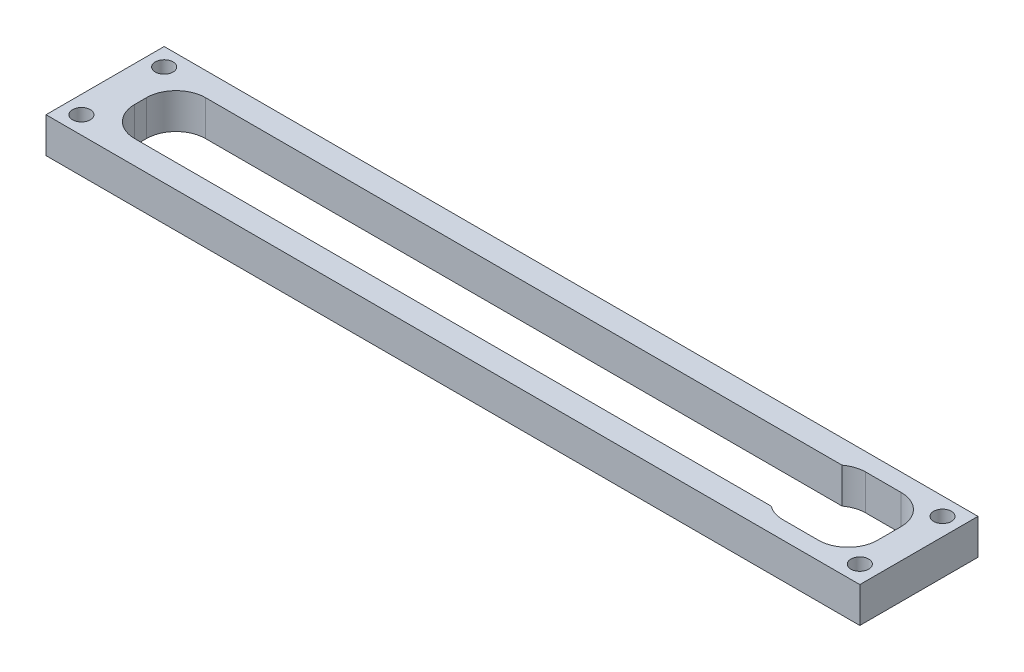
ISO-10303-21;
HEADER;
FILE_DESCRIPTION(('STEP AP214'),'2;1');
FILE_NAME('part.step','',(''),(''),'','','');
FILE_SCHEMA(('AUTOMOTIVE_DESIGN { 1 0 10303 214 1 1 1 1 }'));
ENDSEC;
DATA;
#1=APPLICATION_CONTEXT('core data for automotive mechanical design processes');
#2=APPLICATION_PROTOCOL_DEFINITION('international standard','automotive_design',2000,#1);
#3=PRODUCT_CONTEXT('',#1,'mechanical');
#4=PRODUCT('Part','Part','',(#3));
#5=PRODUCT_RELATED_PRODUCT_CATEGORY('part','',(#4));
#6=PRODUCT_DEFINITION_FORMATION('','',#4);
#7=PRODUCT_DEFINITION_CONTEXT('part definition',#1,'design');
#8=PRODUCT_DEFINITION('design','',#6,#7);
#9=PRODUCT_DEFINITION_SHAPE('','',#8);
#10=(LENGTH_UNIT() NAMED_UNIT(*) SI_UNIT(.MILLI.,.METRE.));
#11=(NAMED_UNIT(*) PLANE_ANGLE_UNIT() SI_UNIT($,.RADIAN.));
#12=(NAMED_UNIT(*) SI_UNIT($,.STERADIAN.) SOLID_ANGLE_UNIT());
#13=UNCERTAINTY_MEASURE_WITH_UNIT(LENGTH_MEASURE(1.E-05),#10,'distance_accuracy_value','');
#14=(GEOMETRIC_REPRESENTATION_CONTEXT(3) GLOBAL_UNCERTAINTY_ASSIGNED_CONTEXT((#13)) GLOBAL_UNIT_ASSIGNED_CONTEXT((#10,
#11,#12)) REPRESENTATION_CONTEXT('',''));
#15=CARTESIAN_POINT('',(0.,0.,0.));
#16=DIRECTION('',(0.,0.,1.));
#17=DIRECTION('',(1.,0.,0.));
#18=AXIS2_PLACEMENT_3D('',#15,#16,#17);
#19=CARTESIAN_POINT('',(0.,6.,0.));
#20=DIRECTION('',(0.,-1.,0.));
#21=DIRECTION('',(0.,0.,-1.));
#22=AXIS2_PLACEMENT_3D('',#19,#20,#21);
#23=PLANE('',#22);
#24=DIRECTION('',(0.,0.,1.));
#25=VECTOR('',#24,1.);
#26=CARTESIAN_POINT('',(0.,6.,0.));
#27=LINE('',#26,#25);
#28=CARTESIAN_POINT('',(0.,6.,-20.));
#29=VERTEX_POINT('',#28);
#30=CARTESIAN_POINT('',(0.,6.,0.));
#31=VERTEX_POINT('',#30);
#32=EDGE_CURVE('E250',#29,#31,#27,.T.);
#33=ORIENTED_EDGE('',*,*,#32,.T.);
#34=DIRECTION('',(1.,0.,0.));
#35=VECTOR('',#34,1.);
#36=CARTESIAN_POINT('',(0.,6.,0.));
#37=LINE('',#36,#35);
#38=CARTESIAN_POINT('',(137.727780531203,6.,0.));
#39=VERTEX_POINT('',#38);
#40=EDGE_CURVE('E253',#31,#39,#37,.T.);
#41=ORIENTED_EDGE('',*,*,#40,.T.);
#42=DIRECTION('',(0.,0.,-1.));
#43=VECTOR('',#42,1.);
#44=CARTESIAN_POINT('',(137.727780531203,6.,0.));
#45=LINE('',#44,#43);
#46=CARTESIAN_POINT('',(137.727780531203,6.,-20.));
#47=VERTEX_POINT('',#46);
#48=EDGE_CURVE('E256',#39,#47,#45,.T.);
#49=ORIENTED_EDGE('',*,*,#48,.T.);
#50=DIRECTION('',(-1.,0.,0.));
#51=VECTOR('',#50,1.);
#52=CARTESIAN_POINT('',(0.,6.,-20.));
#53=LINE('',#52,#51);
#54=EDGE_CURVE('E258',#47,#29,#53,.T.);
#55=ORIENTED_EDGE('',*,*,#54,.T.);
#56=EDGE_LOOP('',(#33,#41,#49,#55));
#57=FACE_BOUND('',#56,.T.);
#58=DIRECTION('',(-1.,0.,0.));
#59=VECTOR('',#58,1.);
#60=CARTESIAN_POINT('',(5.99999999999999,6.,-16.));
#61=LINE('',#60,#59);
#62=CARTESIAN_POINT('',(118.727780531203,6.,-16.));
#63=VERTEX_POINT('',#62);
#64=CARTESIAN_POINT('',(11.,6.,-16.));
#65=VERTEX_POINT('',#64);
#66=EDGE_CURVE('E243',#63,#65,#61,.T.);
#67=ORIENTED_EDGE('',*,*,#66,.F.);
#68=CARTESIAN_POINT('',(121.727780531203,6.,-12.));
#69=DIRECTION('',(0.,-1.,0.));
#70=DIRECTION('',(0.,0.,-1.));
#71=AXIS2_PLACEMENT_3D('',#68,#69,#70);
#72=CIRCLE('',#71,5.);
#73=CARTESIAN_POINT('',(121.727780531203,6.,-17.));
#74=VERTEX_POINT('',#73);
#75=EDGE_CURVE('E193',#63,#74,#72,.T.);
#76=ORIENTED_EDGE('',*,*,#75,.T.);
#77=DIRECTION('',(-1.,0.,0.));
#78=VECTOR('',#77,1.);
#79=CARTESIAN_POINT('',(118.727780531203,6.,-17.));
#80=LINE('',#79,#78);
#81=CARTESIAN_POINT('',(127.727780531203,6.,-17.));
#82=VERTEX_POINT('',#81);
#83=EDGE_CURVE('E205',#82,#74,#80,.T.);
#84=ORIENTED_EDGE('',*,*,#83,.F.);
#85=CARTESIAN_POINT('',(127.727780531203,6.,-12.));
#86=DIRECTION('',(0.,-1.,0.));
#87=DIRECTION('',(0.,0.,-1.));
#88=AXIS2_PLACEMENT_3D('',#85,#86,#87);
#89=CIRCLE('',#88,5.);
#90=CARTESIAN_POINT('',(132.727780531203,6.,-12.));
#91=VERTEX_POINT('',#90);
#92=EDGE_CURVE('E185',#82,#91,#89,.T.);
#93=ORIENTED_EDGE('',*,*,#92,.T.);
#94=DIRECTION('',(0.,0.,-1.));
#95=VECTOR('',#94,1.);
#96=CARTESIAN_POINT('',(132.727780531203,6.,-17.));
#97=LINE('',#96,#95);
#98=CARTESIAN_POINT('',(132.727780531203,6.,-8.00000000000002));
#99=VERTEX_POINT('',#98);
#100=EDGE_CURVE('E202',#99,#91,#97,.T.);
#101=ORIENTED_EDGE('',*,*,#100,.F.);
#102=CARTESIAN_POINT('',(127.727780531203,6.,-8.00000000000002));
#103=DIRECTION('',(0.,-1.,0.));
#104=DIRECTION('',(0.,0.,-1.));
#105=AXIS2_PLACEMENT_3D('',#102,#103,#104);
#106=CIRCLE('',#105,5.);
#107=CARTESIAN_POINT('',(127.727780531203,6.,-3.00000000000002));
#108=VERTEX_POINT('',#107);
#109=EDGE_CURVE('E189',#99,#108,#106,.T.);
#110=ORIENTED_EDGE('',*,*,#109,.T.);
#111=DIRECTION('',(1.,0.,0.));
#112=VECTOR('',#111,1.);
#113=CARTESIAN_POINT('',(118.727780531203,6.,-3.00000000000002));
#114=LINE('',#113,#112);
#115=CARTESIAN_POINT('',(121.727780531203,6.,-3.00000000000002));
#116=VERTEX_POINT('',#115);
#117=EDGE_CURVE('E200',#116,#108,#114,.T.);
#118=ORIENTED_EDGE('',*,*,#117,.F.);
#119=CARTESIAN_POINT('',(121.727780531203,6.,-8.00000000000002));
#120=DIRECTION('',(0.,-1.,0.));
#121=DIRECTION('',(0.,0.,-1.));
#122=AXIS2_PLACEMENT_3D('',#119,#120,#121);
#123=CIRCLE('',#122,5.);
#124=CARTESIAN_POINT('',(118.727780531203,6.,-4.00000000000002));
#125=VERTEX_POINT('',#124);
#126=EDGE_CURVE('E43',#116,#125,#123,.T.);
#127=ORIENTED_EDGE('',*,*,#126,.T.);
#128=DIRECTION('',(1.,0.,0.));
#129=VECTOR('',#128,1.);
#130=CARTESIAN_POINT('',(5.99999999999999,6.,-4.00000000000002));
#131=LINE('',#130,#129);
#132=CARTESIAN_POINT('',(11.,6.,-4.00000000000002));
#133=VERTEX_POINT('',#132);
#134=EDGE_CURVE('E162',#133,#125,#131,.T.);
#135=ORIENTED_EDGE('',*,*,#134,.F.);
#136=CARTESIAN_POINT('',(11.,6.,-9.00000000000001));
#137=DIRECTION('',(0.,-1.,0.));
#138=DIRECTION('',(0.,0.,-1.));
#139=AXIS2_PLACEMENT_3D('',#136,#137,#138);
#140=CIRCLE('',#139,5.);
#141=CARTESIAN_POINT('',(5.99999999999999,6.,-9.00000000000001));
#142=VERTEX_POINT('',#141);
#143=EDGE_CURVE('E179',#133,#142,#140,.T.);
#144=ORIENTED_EDGE('',*,*,#143,.T.);
#145=DIRECTION('',(0.,0.,1.));
#146=VECTOR('',#145,1.);
#147=CARTESIAN_POINT('',(5.99999999999999,6.,-16.));
#148=LINE('',#147,#146);
#149=CARTESIAN_POINT('',(5.99999999999999,6.,-11.));
#150=VERTEX_POINT('',#149);
#151=EDGE_CURVE('E239',#150,#142,#148,.T.);
#152=ORIENTED_EDGE('',*,*,#151,.F.);
#153=CARTESIAN_POINT('',(11.,6.,-11.));
#154=DIRECTION('',(0.,-1.,0.));
#155=DIRECTION('',(0.,0.,-1.));
#156=AXIS2_PLACEMENT_3D('',#153,#154,#155);
#157=CIRCLE('',#156,5.);
#158=EDGE_CURVE('E183',#150,#65,#157,.T.);
#159=ORIENTED_EDGE('',*,*,#158,.T.);
#160=EDGE_LOOP('',(#67,#76,#84,#93,#101,#110,#118,#127,#135,#144,#152,#159));
#161=FACE_BOUND('',#160,.T.);
#162=CARTESIAN_POINT('',(3.,6.,-17.));
#163=DIRECTION('',(0.,1.,0.));
#164=DIRECTION('',(0.,0.,1.));
#165=AXIS2_PLACEMENT_3D('',#162,#163,#164);
#166=CIRCLE('',#165,1.5);
#167=CARTESIAN_POINT('',(3.,6.,-15.5));
#168=VERTEX_POINT('',#167);
#169=EDGE_CURVE('E234',#168,#168,#166,.T.);
#170=ORIENTED_EDGE('',*,*,#169,.F.);
#171=EDGE_LOOP('',(#170));
#172=FACE_BOUND('',#171,.T.);
#173=CARTESIAN_POINT('',(3.,6.,-3.));
#174=DIRECTION('',(0.,1.,0.));
#175=DIRECTION('',(0.,0.,-1.));
#176=AXIS2_PLACEMENT_3D('',#173,#174,#175);
#177=CIRCLE('',#176,1.5);
#178=CARTESIAN_POINT('',(3.,6.,-4.5));
#179=VERTEX_POINT('',#178);
#180=EDGE_CURVE('E228',#179,#179,#177,.T.);
#181=ORIENTED_EDGE('',*,*,#180,.F.);
#182=EDGE_LOOP('',(#181));
#183=FACE_BOUND('',#182,.T.);
#184=CARTESIAN_POINT('',(134.727780531203,6.,-3.00000000000002));
#185=DIRECTION('',(0.,1.,0.));
#186=DIRECTION('',(0.,0.,1.));
#187=AXIS2_PLACEMENT_3D('',#184,#185,#186);
#188=CIRCLE('',#187,1.5);
#189=CARTESIAN_POINT('',(134.727780531203,6.,-1.50000000000002));
#190=VERTEX_POINT('',#189);
#191=EDGE_CURVE('E222',#190,#190,#188,.T.);
#192=ORIENTED_EDGE('',*,*,#191,.F.);
#193=EDGE_LOOP('',(#192));
#194=FACE_BOUND('',#193,.T.);
#195=CARTESIAN_POINT('',(134.727780531203,6.,-17.0000000000001));
#196=DIRECTION('',(0.,1.,0.));
#197=DIRECTION('',(0.,0.,-1.));
#198=AXIS2_PLACEMENT_3D('',#195,#196,#197);
#199=CIRCLE('',#198,1.5);
#200=CARTESIAN_POINT('',(134.727780531203,6.,-18.5));
#201=VERTEX_POINT('',#200);
#202=EDGE_CURVE('E216',#201,#201,#199,.T.);
#203=ORIENTED_EDGE('',*,*,#202,.F.);
#204=EDGE_LOOP('',(#203));
#205=FACE_BOUND('',#204,.T.);
#206=ADVANCED_FACE('F35',(#57,#161,#172,#183,#194,#205),#23,.F.);
#207=CARTESIAN_POINT('',(0.,0.,0.));
#208=DIRECTION('',(0.,-1.,0.));
#209=DIRECTION('',(0.,0.,-1.));
#210=AXIS2_PLACEMENT_3D('',#207,#208,#209);
#211=PLANE('',#210);
#212=DIRECTION('',(-1.,0.,0.));
#213=VECTOR('',#212,1.);
#214=CARTESIAN_POINT('',(118.727780531203,0.,-17.));
#215=LINE('',#214,#213);
#216=CARTESIAN_POINT('',(127.727780531203,0.,-17.));
#217=VERTEX_POINT('',#216);
#218=CARTESIAN_POINT('',(121.727780531203,0.,-17.));
#219=VERTEX_POINT('',#218);
#220=EDGE_CURVE('E165',#217,#219,#215,.T.);
#221=ORIENTED_EDGE('',*,*,#220,.T.);
#222=CARTESIAN_POINT('',(121.727780531203,0.,-12.));
#223=DIRECTION('',(0.,-1.,0.));
#224=DIRECTION('',(0.,0.,-1.));
#225=AXIS2_PLACEMENT_3D('',#222,#223,#224);
#226=CIRCLE('',#225,5.);
#227=CARTESIAN_POINT('',(118.727780531203,0.,-16.));
#228=VERTEX_POINT('',#227);
#229=EDGE_CURVE('E195',#219,#228,#226,.F.);
#230=ORIENTED_EDGE('',*,*,#229,.T.);
#231=DIRECTION('',(-1.,0.,0.));
#232=VECTOR('',#231,1.);
#233=CARTESIAN_POINT('',(5.99999999999999,0.,-16.));
#234=LINE('',#233,#232);
#235=CARTESIAN_POINT('',(11.,0.,-16.));
#236=VERTEX_POINT('',#235);
#237=EDGE_CURVE('E154',#228,#236,#234,.T.);
#238=ORIENTED_EDGE('',*,*,#237,.T.);
#239=CARTESIAN_POINT('',(11.,0.,-11.));
#240=DIRECTION('',(0.,-1.,0.));
#241=DIRECTION('',(0.,0.,-1.));
#242=AXIS2_PLACEMENT_3D('',#239,#240,#241);
#243=CIRCLE('',#242,5.);
#244=CARTESIAN_POINT('',(5.99999999999999,0.,-11.));
#245=VERTEX_POINT('',#244);
#246=EDGE_CURVE('E181',#236,#245,#243,.F.);
#247=ORIENTED_EDGE('',*,*,#246,.T.);
#248=DIRECTION('',(0.,0.,1.));
#249=VECTOR('',#248,1.);
#250=CARTESIAN_POINT('',(5.99999999999999,0.,-16.));
#251=LINE('',#250,#249);
#252=CARTESIAN_POINT('',(5.99999999999999,0.,-9.00000000000001));
#253=VERTEX_POINT('',#252);
#254=EDGE_CURVE('E155',#245,#253,#251,.T.);
#255=ORIENTED_EDGE('',*,*,#254,.T.);
#256=CARTESIAN_POINT('',(11.,0.,-9.00000000000001));
#257=DIRECTION('',(0.,-1.,0.));
#258=DIRECTION('',(0.,0.,-1.));
#259=AXIS2_PLACEMENT_3D('',#256,#257,#258);
#260=CIRCLE('',#259,5.);
#261=CARTESIAN_POINT('',(11.,0.,-4.00000000000002));
#262=VERTEX_POINT('',#261);
#263=EDGE_CURVE('E151',#253,#262,#260,.F.);
#264=ORIENTED_EDGE('',*,*,#263,.T.);
#265=DIRECTION('',(1.,0.,0.));
#266=VECTOR('',#265,1.);
#267=CARTESIAN_POINT('',(5.99999999999999,0.,-4.00000000000002));
#268=LINE('',#267,#266);
#269=CARTESIAN_POINT('',(118.727780531203,0.,-4.00000000000002));
#270=VERTEX_POINT('',#269);
#271=EDGE_CURVE('E145',#262,#270,#268,.T.);
#272=ORIENTED_EDGE('',*,*,#271,.T.);
#273=CARTESIAN_POINT('',(121.727780531203,0.,-8.00000000000002));
#274=DIRECTION('',(0.,-1.,0.));
#275=DIRECTION('',(0.,0.,-1.));
#276=AXIS2_PLACEMENT_3D('',#273,#274,#275);
#277=CIRCLE('',#276,5.);
#278=CARTESIAN_POINT('',(121.727780531203,0.,-3.00000000000002));
#279=VERTEX_POINT('',#278);
#280=EDGE_CURVE('E11',#270,#279,#277,.F.);
#281=ORIENTED_EDGE('',*,*,#280,.T.);
#282=DIRECTION('',(1.,0.,0.));
#283=VECTOR('',#282,1.);
#284=CARTESIAN_POINT('',(118.727780531203,0.,-3.00000000000002));
#285=LINE('',#284,#283);
#286=CARTESIAN_POINT('',(127.727780531203,0.,-3.00000000000002));
#287=VERTEX_POINT('',#286);
#288=EDGE_CURVE('E212',#279,#287,#285,.T.);
#289=ORIENTED_EDGE('',*,*,#288,.T.);
#290=CARTESIAN_POINT('',(127.727780531203,0.,-8.00000000000002));
#291=DIRECTION('',(0.,-1.,0.));
#292=DIRECTION('',(0.,0.,-1.));
#293=AXIS2_PLACEMENT_3D('',#290,#291,#292);
#294=CIRCLE('',#293,5.);
#295=CARTESIAN_POINT('',(132.727780531203,0.,-8.00000000000002));
#296=VERTEX_POINT('',#295);
#297=EDGE_CURVE('E191',#287,#296,#294,.F.);
#298=ORIENTED_EDGE('',*,*,#297,.T.);
#299=DIRECTION('',(0.,0.,-1.));
#300=VECTOR('',#299,1.);
#301=CARTESIAN_POINT('',(132.727780531203,0.,-17.));
#302=LINE('',#301,#300);
#303=CARTESIAN_POINT('',(132.727780531203,0.,-12.));
#304=VERTEX_POINT('',#303);
#305=EDGE_CURVE('E300',#296,#304,#302,.T.);
#306=ORIENTED_EDGE('',*,*,#305,.T.);
#307=CARTESIAN_POINT('',(127.727780531203,0.,-12.));
#308=DIRECTION('',(0.,-1.,0.));
#309=DIRECTION('',(0.,0.,-1.));
#310=AXIS2_PLACEMENT_3D('',#307,#308,#309);
#311=CIRCLE('',#310,5.);
#312=EDGE_CURVE('E187',#304,#217,#311,.F.);
#313=ORIENTED_EDGE('',*,*,#312,.T.);
#314=EDGE_LOOP('',(#221,#230,#238,#247,#255,#264,#272,#281,#289,#298,#306,#313));
#315=FACE_BOUND('',#314,.T.);
#316=CARTESIAN_POINT('',(134.727780531203,0.,-3.00000000000002));
#317=DIRECTION('',(0.,1.,0.));
#318=DIRECTION('',(0.,0.,1.));
#319=AXIS2_PLACEMENT_3D('',#316,#317,#318);
#320=CIRCLE('',#319,1.5);
#321=CARTESIAN_POINT('',(134.727780531203,0.,-1.50000000000002));
#322=VERTEX_POINT('',#321);
#323=EDGE_CURVE('E219',#322,#322,#320,.T.);
#324=ORIENTED_EDGE('',*,*,#323,.T.);
#325=EDGE_LOOP('',(#324));
#326=FACE_BOUND('',#325,.T.);
#327=CARTESIAN_POINT('',(3.,0.,-17.));
#328=DIRECTION('',(0.,1.,0.));
#329=DIRECTION('',(0.,0.,1.));
#330=AXIS2_PLACEMENT_3D('',#327,#328,#329);
#331=CIRCLE('',#330,1.5);
#332=CARTESIAN_POINT('',(3.,0.,-15.5));
#333=VERTEX_POINT('',#332);
#334=EDGE_CURVE('E231',#333,#333,#331,.T.);
#335=ORIENTED_EDGE('',*,*,#334,.T.);
#336=EDGE_LOOP('',(#335));
#337=FACE_BOUND('',#336,.T.);
#338=DIRECTION('',(0.,0.,1.));
#339=VECTOR('',#338,1.);
#340=CARTESIAN_POINT('',(0.,0.,0.));
#341=LINE('',#340,#339);
#342=CARTESIAN_POINT('',(0.,0.,-20.));
#343=VERTEX_POINT('',#342);
#344=CARTESIAN_POINT('',(0.,0.,0.));
#345=VERTEX_POINT('',#344);
#346=EDGE_CURVE('E246',#343,#345,#341,.T.);
#347=ORIENTED_EDGE('',*,*,#346,.F.);
#348=DIRECTION('',(-1.,0.,0.));
#349=VECTOR('',#348,1.);
#350=CARTESIAN_POINT('',(0.,0.,-20.));
#351=LINE('',#350,#349);
#352=CARTESIAN_POINT('',(137.727780531203,0.,-20.));
#353=VERTEX_POINT('',#352);
#354=EDGE_CURVE('E254',#353,#343,#351,.T.);
#355=ORIENTED_EDGE('',*,*,#354,.F.);
#356=DIRECTION('',(0.,0.,-1.));
#357=VECTOR('',#356,1.);
#358=CARTESIAN_POINT('',(137.727780531203,0.,0.));
#359=LINE('',#358,#357);
#360=CARTESIAN_POINT('',(137.727780531203,0.,0.));
#361=VERTEX_POINT('',#360);
#362=EDGE_CURVE('E265',#361,#353,#359,.T.);
#363=ORIENTED_EDGE('',*,*,#362,.F.);
#364=DIRECTION('',(1.,0.,0.));
#365=VECTOR('',#364,1.);
#366=CARTESIAN_POINT('',(0.,0.,0.));
#367=LINE('',#366,#365);
#368=EDGE_CURVE('E263',#345,#361,#367,.T.);
#369=ORIENTED_EDGE('',*,*,#368,.F.);
#370=EDGE_LOOP('',(#347,#355,#363,#369));
#371=FACE_BOUND('',#370,.T.);
#372=CARTESIAN_POINT('',(3.,0.,-3.));
#373=DIRECTION('',(0.,1.,0.));
#374=DIRECTION('',(0.,0.,-1.));
#375=AXIS2_PLACEMENT_3D('',#372,#373,#374);
#376=CIRCLE('',#375,1.5);
#377=CARTESIAN_POINT('',(3.,0.,-4.5));
#378=VERTEX_POINT('',#377);
#379=EDGE_CURVE('E225',#378,#378,#376,.T.);
#380=ORIENTED_EDGE('',*,*,#379,.T.);
#381=EDGE_LOOP('',(#380));
#382=FACE_BOUND('',#381,.T.);
#383=CARTESIAN_POINT('',(134.727780531203,0.,-17.0000000000001));
#384=DIRECTION('',(0.,1.,0.));
#385=DIRECTION('',(0.,0.,-1.));
#386=AXIS2_PLACEMENT_3D('',#383,#384,#385);
#387=CIRCLE('',#386,1.5);
#388=CARTESIAN_POINT('',(134.727780531203,0.,-18.5));
#389=VERTEX_POINT('',#388);
#390=EDGE_CURVE('E214',#389,#389,#387,.T.);
#391=ORIENTED_EDGE('',*,*,#390,.T.);
#392=EDGE_LOOP('',(#391));
#393=FACE_BOUND('',#392,.T.);
#394=ADVANCED_FACE('F148',(#315,#326,#337,#371,#382,#393),#211,.T.);
#395=CARTESIAN_POINT('',(0.,6.,0.));
#396=DIRECTION('',(1.,0.,0.));
#397=DIRECTION('',(0.,0.,-1.));
#398=AXIS2_PLACEMENT_3D('',#395,#396,#397);
#399=PLANE('',#398);
#400=ORIENTED_EDGE('',*,*,#346,.T.);
#401=DIRECTION('',(0.,-1.,0.));
#402=VECTOR('',#401,1.);
#403=CARTESIAN_POINT('',(0.,6.,0.));
#404=LINE('',#403,#402);
#405=EDGE_CURVE('E276',#31,#345,#404,.T.);
#406=ORIENTED_EDGE('',*,*,#405,.F.);
#407=ORIENTED_EDGE('',*,*,#32,.F.);
#408=DIRECTION('',(0.,-1.,0.));
#409=VECTOR('',#408,1.);
#410=CARTESIAN_POINT('',(0.,6.,-20.));
#411=LINE('',#410,#409);
#412=EDGE_CURVE('E260',#29,#343,#411,.T.);
#413=ORIENTED_EDGE('',*,*,#412,.T.);
#414=EDGE_LOOP('',(#400,#406,#407,#413));
#415=FACE_BOUND('',#414,.T.);
#416=ADVANCED_FACE('F331',(#415),#399,.F.);
#417=CARTESIAN_POINT('',(0.,6.,0.));
#418=DIRECTION('',(0.,0.,-1.));
#419=DIRECTION('',(-1.,0.,0.));
#420=AXIS2_PLACEMENT_3D('',#417,#418,#419);
#421=PLANE('',#420);
#422=ORIENTED_EDGE('',*,*,#368,.T.);
#423=DIRECTION('',(0.,-1.,0.));
#424=VECTOR('',#423,1.);
#425=CARTESIAN_POINT('',(137.727780531203,6.,0.));
#426=LINE('',#425,#424);
#427=EDGE_CURVE('E273',#39,#361,#426,.T.);
#428=ORIENTED_EDGE('',*,*,#427,.F.);
#429=ORIENTED_EDGE('',*,*,#40,.F.);
#430=ORIENTED_EDGE('',*,*,#405,.T.);
#431=EDGE_LOOP('',(#422,#428,#429,#430));
#432=FACE_BOUND('',#431,.T.);
#433=ADVANCED_FACE('F344',(#432),#421,.F.);
#434=CARTESIAN_POINT('',(137.727780531203,6.,0.));
#435=DIRECTION('',(-1.,0.,0.));
#436=DIRECTION('',(0.,0.,1.));
#437=AXIS2_PLACEMENT_3D('',#434,#435,#436);
#438=PLANE('',#437);
#439=ORIENTED_EDGE('',*,*,#362,.T.);
#440=DIRECTION('',(0.,-1.,0.));
#441=VECTOR('',#440,1.);
#442=CARTESIAN_POINT('',(137.727780531203,6.,-20.));
#443=LINE('',#442,#441);
#444=EDGE_CURVE('E270',#47,#353,#443,.T.);
#445=ORIENTED_EDGE('',*,*,#444,.F.);
#446=ORIENTED_EDGE('',*,*,#48,.F.);
#447=ORIENTED_EDGE('',*,*,#427,.T.);
#448=EDGE_LOOP('',(#439,#445,#446,#447));
#449=FACE_BOUND('',#448,.T.);
#450=ADVANCED_FACE('F340',(#449),#438,.F.);
#451=CARTESIAN_POINT('',(0.,6.,-20.));
#452=DIRECTION('',(0.,0.,1.));
#453=DIRECTION('',(1.,0.,0.));
#454=AXIS2_PLACEMENT_3D('',#451,#452,#453);
#455=PLANE('',#454);
#456=ORIENTED_EDGE('',*,*,#354,.T.);
#457=ORIENTED_EDGE('',*,*,#412,.F.);
#458=ORIENTED_EDGE('',*,*,#54,.F.);
#459=ORIENTED_EDGE('',*,*,#444,.T.);
#460=EDGE_LOOP('',(#456,#457,#458,#459));
#461=FACE_BOUND('',#460,.T.);
#462=ADVANCED_FACE('F337',(#461),#455,.F.);
#463=CARTESIAN_POINT('',(5.99999999999999,6.,-16.));
#464=DIRECTION('',(1.,0.,0.));
#465=DIRECTION('',(0.,0.,-1.));
#466=AXIS2_PLACEMENT_3D('',#463,#464,#465);
#467=PLANE('',#466);
#468=ORIENTED_EDGE('',*,*,#151,.T.);
#469=DIRECTION('',(0.,-1.,0.));
#470=VECTOR('',#469,1.);
#471=CARTESIAN_POINT('',(5.99999999999999,0.,-9.00000000000001));
#472=LINE('',#471,#470);
#473=EDGE_CURVE('E281',#142,#253,#472,.T.);
#474=ORIENTED_EDGE('',*,*,#473,.T.);
#475=ORIENTED_EDGE('',*,*,#254,.F.);
#476=DIRECTION('',(0.,-1.,0.));
#477=VECTOR('',#476,1.);
#478=CARTESIAN_POINT('',(5.99999999999999,6.,-11.));
#479=LINE('',#478,#477);
#480=EDGE_CURVE('E279',#245,#150,#479,.F.);
#481=ORIENTED_EDGE('',*,*,#480,.T.);
#482=EDGE_LOOP('',(#468,#474,#475,#481));
#483=FACE_BOUND('',#482,.T.);
#484=ADVANCED_FACE('F334',(#483),#467,.T.);
#485=CARTESIAN_POINT('',(5.99999999999999,6.,-4.00000000000002));
#486=DIRECTION('',(0.,0.,-1.));
#487=DIRECTION('',(-1.,0.,0.));
#488=AXIS2_PLACEMENT_3D('',#485,#486,#487);
#489=PLANE('',#488);
#490=ORIENTED_EDGE('',*,*,#271,.F.);
#491=DIRECTION('',(0.,-1.,0.));
#492=VECTOR('',#491,1.);
#493=CARTESIAN_POINT('',(11.,6.,-4.00000000000002));
#494=LINE('',#493,#492);
#495=EDGE_CURVE('E284',#262,#133,#494,.F.);
#496=ORIENTED_EDGE('',*,*,#495,.T.);
#497=ORIENTED_EDGE('',*,*,#134,.T.);
#498=DIRECTION('',(0.,1.,0.));
#499=VECTOR('',#498,1.);
#500=CARTESIAN_POINT('',(118.727780531203,0.,-4.00000000000002));
#501=LINE('',#500,#499);
#502=EDGE_CURVE('E159',#270,#125,#501,.T.);
#503=ORIENTED_EDGE('',*,*,#502,.F.);
#504=EDGE_LOOP('',(#490,#496,#497,#503));
#505=FACE_BOUND('',#504,.T.);
#506=ADVANCED_FACE('F160',(#505),#489,.T.);
#507=CARTESIAN_POINT('',(5.99999999999999,6.,-16.));
#508=DIRECTION('',(0.,0.,1.));
#509=DIRECTION('',(1.,0.,0.));
#510=AXIS2_PLACEMENT_3D('',#507,#508,#509);
#511=PLANE('',#510);
#512=ORIENTED_EDGE('',*,*,#66,.T.);
#513=DIRECTION('',(0.,-1.,0.));
#514=VECTOR('',#513,1.);
#515=CARTESIAN_POINT('',(11.,0.,-16.));
#516=LINE('',#515,#514);
#517=EDGE_CURVE('E286',#65,#236,#516,.T.);
#518=ORIENTED_EDGE('',*,*,#517,.T.);
#519=ORIENTED_EDGE('',*,*,#237,.F.);
#520=DIRECTION('',(0.,1.,0.));
#521=VECTOR('',#520,1.);
#522=CARTESIAN_POINT('',(118.727780531203,0.,-16.));
#523=LINE('',#522,#521);
#524=EDGE_CURVE('E164',#228,#63,#523,.T.);
#525=ORIENTED_EDGE('',*,*,#524,.T.);
#526=EDGE_LOOP('',(#512,#518,#519,#525));
#527=FACE_BOUND('',#526,.T.);
#528=ADVANCED_FACE('F366',(#527),#511,.T.);
#529=CARTESIAN_POINT('',(3.,6.,-17.));
#530=DIRECTION('',(0.,-1.,0.));
#531=DIRECTION('',(0.,0.,-1.));
#532=AXIS2_PLACEMENT_3D('',#529,#530,#531);
#533=CYLINDRICAL_SURFACE('',#532,1.5);
#534=ORIENTED_EDGE('',*,*,#169,.T.);
#535=EDGE_LOOP('',(#534));
#536=FACE_BOUND('',#535,.T.);
#537=ORIENTED_EDGE('',*,*,#334,.F.);
#538=EDGE_LOOP('',(#537));
#539=FACE_BOUND('',#538,.T.);
#540=ADVANCED_FACE('F379',(#536,#539),#533,.F.);
#541=CARTESIAN_POINT('',(3.,6.,-3.));
#542=DIRECTION('',(0.,-1.,0.));
#543=DIRECTION('',(0.,0.,-1.));
#544=AXIS2_PLACEMENT_3D('',#541,#542,#543);
#545=CYLINDRICAL_SURFACE('',#544,1.5);
#546=ORIENTED_EDGE('',*,*,#180,.T.);
#547=EDGE_LOOP('',(#546));
#548=FACE_BOUND('',#547,.T.);
#549=ORIENTED_EDGE('',*,*,#379,.F.);
#550=EDGE_LOOP('',(#549));
#551=FACE_BOUND('',#550,.T.);
#552=ADVANCED_FACE('F384',(#548,#551),#545,.F.);
#553=CARTESIAN_POINT('',(134.727780531203,6.,-3.00000000000002));
#554=DIRECTION('',(0.,-1.,0.));
#555=DIRECTION('',(0.,0.,-1.));
#556=AXIS2_PLACEMENT_3D('',#553,#554,#555);
#557=CYLINDRICAL_SURFACE('',#556,1.5);
#558=ORIENTED_EDGE('',*,*,#191,.T.);
#559=EDGE_LOOP('',(#558));
#560=FACE_BOUND('',#559,.T.);
#561=ORIENTED_EDGE('',*,*,#323,.F.);
#562=EDGE_LOOP('',(#561));
#563=FACE_BOUND('',#562,.T.);
#564=ADVANCED_FACE('F388',(#560,#563),#557,.F.);
#565=CARTESIAN_POINT('',(134.727780531203,6.,-17.0000000000001));
#566=DIRECTION('',(0.,-1.,0.));
#567=DIRECTION('',(0.,0.,-1.));
#568=AXIS2_PLACEMENT_3D('',#565,#566,#567);
#569=CYLINDRICAL_SURFACE('',#568,1.5);
#570=ORIENTED_EDGE('',*,*,#202,.T.);
#571=EDGE_LOOP('',(#570));
#572=FACE_BOUND('',#571,.T.);
#573=ORIENTED_EDGE('',*,*,#390,.F.);
#574=EDGE_LOOP('',(#573));
#575=FACE_BOUND('',#574,.T.);
#576=ADVANCED_FACE('F392',(#572,#575),#569,.F.);
#577=CARTESIAN_POINT('',(118.727780531203,0.,-17.));
#578=DIRECTION('',(0.,0.,-1.));
#579=DIRECTION('',(-1.,0.,0.));
#580=AXIS2_PLACEMENT_3D('',#577,#578,#579);
#581=PLANE('',#580);
#582=ORIENTED_EDGE('',*,*,#220,.F.);
#583=DIRECTION('',(0.,1.,0.));
#584=VECTOR('',#583,1.);
#585=CARTESIAN_POINT('',(127.727780531203,6.,-17.));
#586=LINE('',#585,#584);
#587=EDGE_CURVE('E291',#217,#82,#586,.T.);
#588=ORIENTED_EDGE('',*,*,#587,.T.);
#589=ORIENTED_EDGE('',*,*,#83,.T.);
#590=DIRECTION('',(0.,1.,0.));
#591=VECTOR('',#590,1.);
#592=CARTESIAN_POINT('',(121.727780531203,0.,-17.));
#593=LINE('',#592,#591);
#594=EDGE_CURVE('E289',#74,#219,#593,.F.);
#595=ORIENTED_EDGE('',*,*,#594,.T.);
#596=EDGE_LOOP('',(#582,#588,#589,#595));
#597=FACE_BOUND('',#596,.T.);
#598=ADVANCED_FACE('F310',(#597),#581,.F.);
#599=CARTESIAN_POINT('',(132.727780531203,0.,-17.));
#600=DIRECTION('',(1.,0.,0.));
#601=DIRECTION('',(0.,0.,-1.));
#602=AXIS2_PLACEMENT_3D('',#599,#600,#601);
#603=PLANE('',#602);
#604=ORIENTED_EDGE('',*,*,#100,.T.);
#605=DIRECTION('',(0.,1.,0.));
#606=VECTOR('',#605,1.);
#607=CARTESIAN_POINT('',(132.727780531203,0.,-12.));
#608=LINE('',#607,#606);
#609=EDGE_CURVE('E171',#91,#304,#608,.F.);
#610=ORIENTED_EDGE('',*,*,#609,.T.);
#611=ORIENTED_EDGE('',*,*,#305,.F.);
#612=DIRECTION('',(0.,1.,0.));
#613=VECTOR('',#612,1.);
#614=CARTESIAN_POINT('',(132.727780531203,6.,-8.00000000000002));
#615=LINE('',#614,#613);
#616=EDGE_CURVE('E174',#296,#99,#615,.T.);
#617=ORIENTED_EDGE('',*,*,#616,.T.);
#618=EDGE_LOOP('',(#604,#610,#611,#617));
#619=FACE_BOUND('',#618,.T.);
#620=ADVANCED_FACE('F297',(#619),#603,.F.);
#621=CARTESIAN_POINT('',(118.727780531203,0.,-3.00000000000002));
#622=DIRECTION('',(0.,0.,1.));
#623=DIRECTION('',(1.,0.,0.));
#624=AXIS2_PLACEMENT_3D('',#621,#622,#623);
#625=PLANE('',#624);
#626=ORIENTED_EDGE('',*,*,#117,.T.);
#627=DIRECTION('',(0.,1.,0.));
#628=VECTOR('',#627,1.);
#629=CARTESIAN_POINT('',(127.727780531203,0.,-3.00000000000003));
#630=LINE('',#629,#628);
#631=EDGE_CURVE('E50',#108,#287,#630,.F.);
#632=ORIENTED_EDGE('',*,*,#631,.T.);
#633=ORIENTED_EDGE('',*,*,#288,.F.);
#634=DIRECTION('',(0.,-1.,0.));
#635=VECTOR('',#634,1.);
#636=CARTESIAN_POINT('',(121.727780531203,0.,-3.00000000000002));
#637=LINE('',#636,#635);
#638=EDGE_CURVE('E169',#279,#116,#637,.F.);
#639=ORIENTED_EDGE('',*,*,#638,.T.);
#640=EDGE_LOOP('',(#626,#632,#633,#639));
#641=FACE_BOUND('',#640,.T.);
#642=ADVANCED_FACE('F355',(#641),#625,.F.);
#643=CARTESIAN_POINT('',(11.,6.,-9.00000000000001));
#644=DIRECTION('',(0.,1.,0.));
#645=DIRECTION('',(0.,0.,1.));
#646=AXIS2_PLACEMENT_3D('',#643,#644,#645);
#647=CYLINDRICAL_SURFACE('',#646,5.);
#648=ORIENTED_EDGE('',*,*,#143,.F.);
#649=ORIENTED_EDGE('',*,*,#495,.F.);
#650=ORIENTED_EDGE('',*,*,#263,.F.);
#651=ORIENTED_EDGE('',*,*,#473,.F.);
#652=EDGE_LOOP('',(#648,#649,#650,#651));
#653=FACE_BOUND('',#652,.T.);
#654=ADVANCED_FACE('F352',(#653),#647,.F.);
#655=CARTESIAN_POINT('',(11.,6.,-11.));
#656=DIRECTION('',(0.,1.,0.));
#657=DIRECTION('',(0.,0.,1.));
#658=AXIS2_PLACEMENT_3D('',#655,#656,#657);
#659=CYLINDRICAL_SURFACE('',#658,5.);
#660=ORIENTED_EDGE('',*,*,#158,.F.);
#661=ORIENTED_EDGE('',*,*,#480,.F.);
#662=ORIENTED_EDGE('',*,*,#246,.F.);
#663=ORIENTED_EDGE('',*,*,#517,.F.);
#664=EDGE_LOOP('',(#660,#661,#662,#663));
#665=FACE_BOUND('',#664,.T.);
#666=ADVANCED_FACE('F323',(#665),#659,.F.);
#667=CARTESIAN_POINT('',(127.727780531203,0.,-12.));
#668=DIRECTION('',(0.,-1.,0.));
#669=DIRECTION('',(0.,0.,-1.));
#670=AXIS2_PLACEMENT_3D('',#667,#668,#669);
#671=CYLINDRICAL_SURFACE('',#670,5.);
#672=ORIENTED_EDGE('',*,*,#312,.F.);
#673=ORIENTED_EDGE('',*,*,#609,.F.);
#674=ORIENTED_EDGE('',*,*,#92,.F.);
#675=ORIENTED_EDGE('',*,*,#587,.F.);
#676=EDGE_LOOP('',(#672,#673,#674,#675));
#677=FACE_BOUND('',#676,.T.);
#678=ADVANCED_FACE('F307',(#677),#671,.F.);
#679=CARTESIAN_POINT('',(127.727780531203,0.,-8.00000000000002));
#680=DIRECTION('',(0.,-1.,0.));
#681=DIRECTION('',(0.,0.,-1.));
#682=AXIS2_PLACEMENT_3D('',#679,#680,#681);
#683=CYLINDRICAL_SURFACE('',#682,5.);
#684=ORIENTED_EDGE('',*,*,#297,.F.);
#685=ORIENTED_EDGE('',*,*,#631,.F.);
#686=ORIENTED_EDGE('',*,*,#109,.F.);
#687=ORIENTED_EDGE('',*,*,#616,.F.);
#688=EDGE_LOOP('',(#684,#685,#686,#687));
#689=FACE_BOUND('',#688,.T.);
#690=ADVANCED_FACE('F314',(#689),#683,.F.);
#691=CARTESIAN_POINT('',(121.727780531203,0.,-12.));
#692=DIRECTION('',(0.,1.,0.));
#693=DIRECTION('',(0.,0.,1.));
#694=AXIS2_PLACEMENT_3D('',#691,#692,#693);
#695=CYLINDRICAL_SURFACE('',#694,5.);
#696=ORIENTED_EDGE('',*,*,#229,.F.);
#697=ORIENTED_EDGE('',*,*,#594,.F.);
#698=ORIENTED_EDGE('',*,*,#75,.F.);
#699=ORIENTED_EDGE('',*,*,#524,.F.);
#700=EDGE_LOOP('',(#696,#697,#698,#699));
#701=FACE_BOUND('',#700,.T.);
#702=ADVANCED_FACE('F316',(#701),#695,.F.);
#703=CARTESIAN_POINT('',(121.727780531203,0.,-8.00000000000002));
#704=DIRECTION('',(0.,-1.,0.));
#705=DIRECTION('',(0.,0.,-1.));
#706=AXIS2_PLACEMENT_3D('',#703,#704,#705);
#707=CYLINDRICAL_SURFACE('',#706,5.);
#708=ORIENTED_EDGE('',*,*,#280,.F.);
#709=ORIENTED_EDGE('',*,*,#502,.T.);
#710=ORIENTED_EDGE('',*,*,#126,.F.);
#711=ORIENTED_EDGE('',*,*,#638,.F.);
#712=EDGE_LOOP('',(#708,#709,#710,#711));
#713=FACE_BOUND('',#712,.T.);
#714=ADVANCED_FACE('F37',(#713),#707,.F.);
#715=CLOSED_SHELL('',(#206,#394,#416,#433,#450,#462,#484,#506,#528,#540,#552,#564,#576,#598,
#620,#642,#654,#666,#678,#690,#702,#714));
#716=MANIFOLD_SOLID_BREP('B2',#715);
#717=ADVANCED_BREP_SHAPE_REPRESENTATION('',(#18,#716),#14);
#718=SHAPE_DEFINITION_REPRESENTATION(#9,#717);
ENDSEC;
END-ISO-10303-21;
